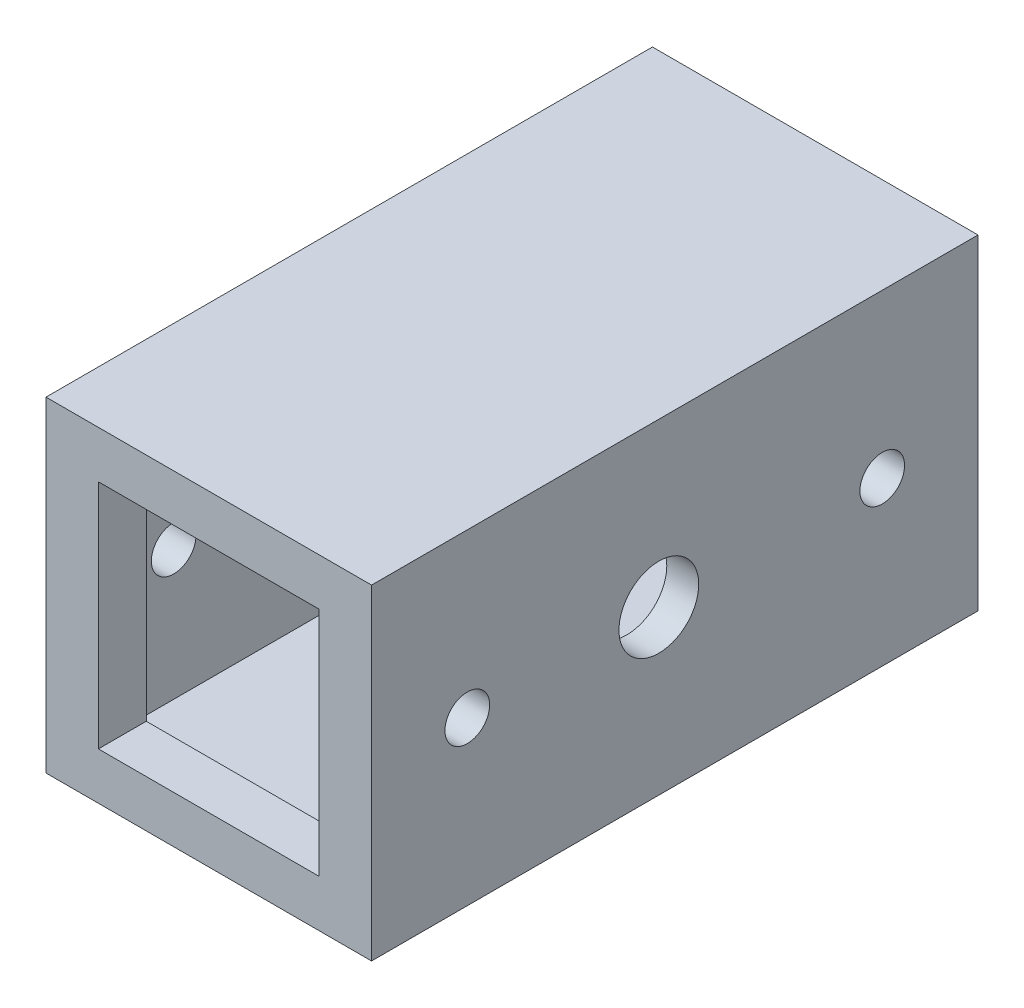
ISO-10303-21;
HEADER;
FILE_DESCRIPTION(('STEP AP214'),'2;1');
FILE_NAME('part.step','',(''),(''),'','','');
FILE_SCHEMA(('AUTOMOTIVE_DESIGN { 1 0 10303 214 1 1 1 1 }'));
ENDSEC;
DATA;
#1=APPLICATION_CONTEXT('core data for automotive mechanical design processes');
#2=APPLICATION_PROTOCOL_DEFINITION('international standard','automotive_design',2000,#1);
#3=PRODUCT_CONTEXT('',#1,'mechanical');
#4=PRODUCT('Part','Part','',(#3));
#5=PRODUCT_RELATED_PRODUCT_CATEGORY('part','',(#4));
#6=PRODUCT_DEFINITION_FORMATION('','',#4);
#7=PRODUCT_DEFINITION_CONTEXT('part definition',#1,'design');
#8=PRODUCT_DEFINITION('design','',#6,#7);
#9=PRODUCT_DEFINITION_SHAPE('','',#8);
#10=(LENGTH_UNIT() NAMED_UNIT(*) SI_UNIT(.MILLI.,.METRE.));
#11=(NAMED_UNIT(*) PLANE_ANGLE_UNIT() SI_UNIT($,.RADIAN.));
#12=(NAMED_UNIT(*) SI_UNIT($,.STERADIAN.) SOLID_ANGLE_UNIT());
#13=UNCERTAINTY_MEASURE_WITH_UNIT(LENGTH_MEASURE(1.E-05),#10,'distance_accuracy_value','');
#14=(GEOMETRIC_REPRESENTATION_CONTEXT(3) GLOBAL_UNCERTAINTY_ASSIGNED_CONTEXT((#13)) GLOBAL_UNIT_ASSIGNED_CONTEXT((#10,
#11,#12)) REPRESENTATION_CONTEXT('',''));
#15=CARTESIAN_POINT('',(0.,0.,0.));
#16=DIRECTION('',(0.,0.,1.));
#17=DIRECTION('',(1.,0.,0.));
#18=AXIS2_PLACEMENT_3D('',#15,#16,#17);
#19=CARTESIAN_POINT('',(10.2,-10.2,-35.));
#20=DIRECTION('',(1.,0.,0.));
#21=DIRECTION('',(0.,0.,-1.));
#22=AXIS2_PLACEMENT_3D('',#19,#20,#21);
#23=PLANE('',#22);
#24=CARTESIAN_POINT('',(10.2,0.,-2.99999999999998));
#25=DIRECTION('',(1.,0.,0.));
#26=DIRECTION('',(0.,0.,-1.));
#27=AXIS2_PLACEMENT_3D('',#24,#25,#26);
#28=CIRCLE('',#27,1.4);
#29=CARTESIAN_POINT('',(10.2,0.,-4.39999999999998));
#30=VERTEX_POINT('',#29);
#31=EDGE_CURVE('E686',#30,#30,#28,.T.);
#32=ORIENTED_EDGE('',*,*,#31,.F.);
#33=EDGE_LOOP('',(#32));
#34=FACE_BOUND('',#33,.T.);
#35=CARTESIAN_POINT('',(10.2,0.,-29.));
#36=DIRECTION('',(1.,0.,0.));
#37=DIRECTION('',(0.,0.,-1.));
#38=AXIS2_PLACEMENT_3D('',#35,#36,#37);
#39=CIRCLE('',#38,1.4);
#40=CARTESIAN_POINT('',(10.2,0.,-30.4));
#41=VERTEX_POINT('',#40);
#42=EDGE_CURVE('E684',#41,#41,#39,.T.);
#43=ORIENTED_EDGE('',*,*,#42,.F.);
#44=EDGE_LOOP('',(#43));
#45=FACE_BOUND('',#44,.T.);
#46=CARTESIAN_POINT('',(10.2,0.,-15.));
#47=DIRECTION('',(1.,0.,0.));
#48=DIRECTION('',(0.,0.,-1.));
#49=AXIS2_PLACEMENT_3D('',#46,#47,#48);
#50=CIRCLE('',#49,2.5);
#51=CARTESIAN_POINT('',(10.2,0.,-17.5));
#52=VERTEX_POINT('',#51);
#53=EDGE_CURVE('E336',#52,#52,#50,.T.);
#54=ORIENTED_EDGE('',*,*,#53,.F.);
#55=EDGE_LOOP('',(#54));
#56=FACE_BOUND('',#55,.T.);
#57=DIRECTION('',(0.,0.,1.));
#58=VECTOR('',#57,1.);
#59=CARTESIAN_POINT('',(10.2,10.2,-35.));
#60=LINE('',#59,#58);
#61=CARTESIAN_POINT('',(10.2,10.2,-35.));
#62=VERTEX_POINT('',#61);
#63=CARTESIAN_POINT('',(10.2,10.2,3.));
#64=VERTEX_POINT('',#63);
#65=EDGE_CURVE('E272',#62,#64,#60,.T.);
#66=ORIENTED_EDGE('',*,*,#65,.T.);
#67=DIRECTION('',(0.,1.,0.));
#68=VECTOR('',#67,1.);
#69=CARTESIAN_POINT('',(10.2,10.2,3.));
#70=LINE('',#69,#68);
#71=CARTESIAN_POINT('',(10.2,-10.2,3.));
#72=VERTEX_POINT('',#71);
#73=EDGE_CURVE('E181',#72,#64,#70,.T.);
#74=ORIENTED_EDGE('',*,*,#73,.F.);
#75=DIRECTION('',(0.,0.,1.));
#76=VECTOR('',#75,1.);
#77=CARTESIAN_POINT('',(10.2,-10.2,-35.));
#78=LINE('',#77,#76);
#79=CARTESIAN_POINT('',(10.2,-10.2,-35.));
#80=VERTEX_POINT('',#79);
#81=EDGE_CURVE('E273',#80,#72,#78,.T.);
#82=ORIENTED_EDGE('',*,*,#81,.F.);
#83=DIRECTION('',(0.,1.,0.));
#84=VECTOR('',#83,1.);
#85=CARTESIAN_POINT('',(10.2,-10.2,-35.));
#86=LINE('',#85,#84);
#87=EDGE_CURVE('E250',#80,#62,#86,.T.);
#88=ORIENTED_EDGE('',*,*,#87,.T.);
#89=EDGE_LOOP('',(#66,#74,#82,#88));
#90=FACE_BOUND('',#89,.T.);
#91=ADVANCED_FACE('F45',(#34,#45,#56,#90),#23,.T.);
#92=CARTESIAN_POINT('',(-10.2,-10.2,-35.));
#93=DIRECTION('',(0.,-1.,0.));
#94=DIRECTION('',(0.,0.,-1.));
#95=AXIS2_PLACEMENT_3D('',#92,#93,#94);
#96=PLANE('',#95);
#97=ORIENTED_EDGE('',*,*,#81,.T.);
#98=DIRECTION('',(1.,0.,0.));
#99=VECTOR('',#98,1.);
#100=CARTESIAN_POINT('',(10.2,-10.2,3.));
#101=LINE('',#100,#99);
#102=CARTESIAN_POINT('',(-10.2,-10.2,3.));
#103=VERTEX_POINT('',#102);
#104=EDGE_CURVE('E227',#103,#72,#101,.T.);
#105=ORIENTED_EDGE('',*,*,#104,.F.);
#106=DIRECTION('',(0.,0.,1.));
#107=VECTOR('',#106,1.);
#108=CARTESIAN_POINT('',(-10.2,-10.2,-35.));
#109=LINE('',#108,#107);
#110=CARTESIAN_POINT('',(-10.2,-10.2,-35.));
#111=VERTEX_POINT('',#110);
#112=EDGE_CURVE('E277',#111,#103,#109,.T.);
#113=ORIENTED_EDGE('',*,*,#112,.F.);
#114=DIRECTION('',(1.,0.,0.));
#115=VECTOR('',#114,1.);
#116=CARTESIAN_POINT('',(-10.2,-10.2,-35.));
#117=LINE('',#116,#115);
#118=EDGE_CURVE('E268',#111,#80,#117,.T.);
#119=ORIENTED_EDGE('',*,*,#118,.T.);
#120=EDGE_LOOP('',(#97,#105,#113,#119));
#121=FACE_BOUND('',#120,.T.);
#122=ADVANCED_FACE('F376',(#121),#96,.T.);
#123=CARTESIAN_POINT('',(-10.2,-10.2,-35.));
#124=DIRECTION('',(-1.,0.,0.));
#125=DIRECTION('',(0.,0.,1.));
#126=AXIS2_PLACEMENT_3D('',#123,#124,#125);
#127=PLANE('',#126);
#128=CARTESIAN_POINT('',(-10.2,0.,-2.99999999999998));
#129=DIRECTION('',(1.,0.,0.));
#130=DIRECTION('',(0.,0.,-1.));
#131=AXIS2_PLACEMENT_3D('',#128,#129,#130);
#132=CIRCLE('',#131,1.4);
#133=CARTESIAN_POINT('',(-10.2,0.,-4.39999999999998));
#134=VERTEX_POINT('',#133);
#135=EDGE_CURVE('E289',#134,#134,#132,.T.);
#136=ORIENTED_EDGE('',*,*,#135,.T.);
#137=EDGE_LOOP('',(#136));
#138=FACE_BOUND('',#137,.T.);
#139=CARTESIAN_POINT('',(-10.2,0.,-29.));
#140=DIRECTION('',(1.,0.,0.));
#141=DIRECTION('',(0.,0.,-1.));
#142=AXIS2_PLACEMENT_3D('',#139,#140,#141);
#143=CIRCLE('',#142,1.4);
#144=CARTESIAN_POINT('',(-10.2,0.,-30.4));
#145=VERTEX_POINT('',#144);
#146=EDGE_CURVE('E342',#145,#145,#143,.T.);
#147=ORIENTED_EDGE('',*,*,#146,.T.);
#148=EDGE_LOOP('',(#147));
#149=FACE_BOUND('',#148,.T.);
#150=CARTESIAN_POINT('',(-10.2,0.,-15.));
#151=DIRECTION('',(1.,0.,0.));
#152=DIRECTION('',(0.,0.,-1.));
#153=AXIS2_PLACEMENT_3D('',#150,#151,#152);
#154=CIRCLE('',#153,2.5);
#155=CARTESIAN_POINT('',(-10.2,0.,-17.5));
#156=VERTEX_POINT('',#155);
#157=EDGE_CURVE('E330',#156,#156,#154,.T.);
#158=ORIENTED_EDGE('',*,*,#157,.T.);
#159=EDGE_LOOP('',(#158));
#160=FACE_BOUND('',#159,.T.);
#161=ORIENTED_EDGE('',*,*,#112,.T.);
#162=DIRECTION('',(0.,-1.,0.));
#163=VECTOR('',#162,1.);
#164=CARTESIAN_POINT('',(-10.2,10.2,3.));
#165=LINE('',#164,#163);
#166=CARTESIAN_POINT('',(-10.2,10.2,3.));
#167=VERTEX_POINT('',#166);
#168=EDGE_CURVE('E224',#167,#103,#165,.T.);
#169=ORIENTED_EDGE('',*,*,#168,.F.);
#170=DIRECTION('',(0.,0.,1.));
#171=VECTOR('',#170,1.);
#172=CARTESIAN_POINT('',(-10.2,10.2,-35.));
#173=LINE('',#172,#171);
#174=CARTESIAN_POINT('',(-10.2,10.2,-35.));
#175=VERTEX_POINT('',#174);
#176=EDGE_CURVE('E280',#175,#167,#173,.T.);
#177=ORIENTED_EDGE('',*,*,#176,.F.);
#178=DIRECTION('',(0.,-1.,0.));
#179=VECTOR('',#178,1.);
#180=CARTESIAN_POINT('',(-10.2,-10.2,-35.));
#181=LINE('',#180,#179);
#182=EDGE_CURVE('E264',#175,#111,#181,.T.);
#183=ORIENTED_EDGE('',*,*,#182,.T.);
#184=EDGE_LOOP('',(#161,#169,#177,#183));
#185=FACE_BOUND('',#184,.T.);
#186=ADVANCED_FACE('F382',(#138,#149,#160,#185),#127,.T.);
#187=CARTESIAN_POINT('',(-10.2,10.2,-35.));
#188=DIRECTION('',(0.,1.,0.));
#189=DIRECTION('',(0.,0.,1.));
#190=AXIS2_PLACEMENT_3D('',#187,#188,#189);
#191=PLANE('',#190);
#192=ORIENTED_EDGE('',*,*,#176,.T.);
#193=DIRECTION('',(-1.,0.,0.));
#194=VECTOR('',#193,1.);
#195=CARTESIAN_POINT('',(10.2,10.2,3.));
#196=LINE('',#195,#194);
#197=EDGE_CURVE('E220',#64,#167,#196,.T.);
#198=ORIENTED_EDGE('',*,*,#197,.F.);
#199=ORIENTED_EDGE('',*,*,#65,.F.);
#200=DIRECTION('',(-1.,0.,0.));
#201=VECTOR('',#200,1.);
#202=CARTESIAN_POINT('',(-10.2,10.2,-35.));
#203=LINE('',#202,#201);
#204=EDGE_CURVE('E260',#62,#175,#203,.T.);
#205=ORIENTED_EDGE('',*,*,#204,.T.);
#206=EDGE_LOOP('',(#192,#198,#199,#205));
#207=FACE_BOUND('',#206,.T.);
#208=ADVANCED_FACE('F389',(#207),#191,.T.);
#209=CARTESIAN_POINT('',(0.,0.,-35.));
#210=DIRECTION('',(0.,0.,-1.));
#211=DIRECTION('',(-1.,0.,0.));
#212=AXIS2_PLACEMENT_3D('',#209,#210,#211);
#213=PLANE('',#212);
#214=DIRECTION('',(-1.,0.,0.));
#215=VECTOR('',#214,1.);
#216=CARTESIAN_POINT('',(-8.2,9.2,-35.));
#217=LINE('',#216,#215);
#218=CARTESIAN_POINT('',(9.2,9.2,-35.));
#219=VERTEX_POINT('',#218);
#220=CARTESIAN_POINT('',(-9.2,9.2,-35.));
#221=VERTEX_POINT('',#220);
#222=EDGE_CURVE('E276',#219,#221,#217,.T.);
#223=ORIENTED_EDGE('',*,*,#222,.T.);
#224=DIRECTION('',(0.,-1.,0.));
#225=VECTOR('',#224,1.);
#226=CARTESIAN_POINT('',(-9.2,-8.2,-35.));
#227=LINE('',#226,#225);
#228=CARTESIAN_POINT('',(-9.2,-9.2,-35.));
#229=VERTEX_POINT('',#228);
#230=EDGE_CURVE('E306',#221,#229,#227,.T.);
#231=ORIENTED_EDGE('',*,*,#230,.T.);
#232=DIRECTION('',(1.,0.,0.));
#233=VECTOR('',#232,1.);
#234=CARTESIAN_POINT('',(8.2,-9.2,-35.));
#235=LINE('',#234,#233);
#236=CARTESIAN_POINT('',(9.2,-9.2,-35.));
#237=VERTEX_POINT('',#236);
#238=EDGE_CURVE('E303',#229,#237,#235,.T.);
#239=ORIENTED_EDGE('',*,*,#238,.T.);
#240=DIRECTION('',(0.,1.,0.));
#241=VECTOR('',#240,1.);
#242=CARTESIAN_POINT('',(9.2,8.2,-35.));
#243=LINE('',#242,#241);
#244=EDGE_CURVE('E301',#237,#219,#243,.T.);
#245=ORIENTED_EDGE('',*,*,#244,.T.);
#246=EDGE_LOOP('',(#223,#231,#239,#245));
#247=FACE_BOUND('',#246,.T.);
#248=ORIENTED_EDGE('',*,*,#87,.F.);
#249=ORIENTED_EDGE('',*,*,#118,.F.);
#250=ORIENTED_EDGE('',*,*,#182,.F.);
#251=ORIENTED_EDGE('',*,*,#204,.F.);
#252=EDGE_LOOP('',(#248,#249,#250,#251));
#253=FACE_BOUND('',#252,.T.);
#254=ADVANCED_FACE('F415',(#247,#253),#213,.T.);
#255=CARTESIAN_POINT('',(8.2,-8.2,-35.));
#256=DIRECTION('',(1.,0.,0.));
#257=DIRECTION('',(0.,0.,-1.));
#258=AXIS2_PLACEMENT_3D('',#255,#256,#257);
#259=PLANE('',#258);
#260=CARTESIAN_POINT('',(8.19999999999999,0.,-2.99999999999998));
#261=DIRECTION('',(1.,0.,0.));
#262=DIRECTION('',(0.,0.,-1.));
#263=AXIS2_PLACEMENT_3D('',#260,#261,#262);
#264=CIRCLE('',#263,1.4);
#265=CARTESIAN_POINT('',(8.19999999999999,0.,-4.39999999999998));
#266=VERTEX_POINT('',#265);
#267=EDGE_CURVE('E202',#266,#266,#264,.T.);
#268=ORIENTED_EDGE('',*,*,#267,.T.);
#269=EDGE_LOOP('',(#268));
#270=FACE_BOUND('',#269,.T.);
#271=CARTESIAN_POINT('',(8.19999999999999,0.,-29.));
#272=DIRECTION('',(1.,0.,0.));
#273=DIRECTION('',(0.,0.,-1.));
#274=AXIS2_PLACEMENT_3D('',#271,#272,#273);
#275=CIRCLE('',#274,1.4);
#276=CARTESIAN_POINT('',(8.19999999999999,0.,-30.4));
#277=VERTEX_POINT('',#276);
#278=EDGE_CURVE('E294',#277,#277,#275,.T.);
#279=ORIENTED_EDGE('',*,*,#278,.T.);
#280=EDGE_LOOP('',(#279));
#281=FACE_BOUND('',#280,.T.);
#282=CARTESIAN_POINT('',(8.19999999999999,0.,-15.));
#283=DIRECTION('',(1.,0.,0.));
#284=DIRECTION('',(0.,0.,-1.));
#285=AXIS2_PLACEMENT_3D('',#282,#283,#284);
#286=CIRCLE('',#285,2.5);
#287=CARTESIAN_POINT('',(8.19999999999999,0.,-17.5));
#288=VERTEX_POINT('',#287);
#289=EDGE_CURVE('E288',#288,#288,#286,.T.);
#290=ORIENTED_EDGE('',*,*,#289,.T.);
#291=EDGE_LOOP('',(#290));
#292=FACE_BOUND('',#291,.T.);
#293=DIRECTION('',(0.,0.,1.));
#294=VECTOR('',#293,1.);
#295=CARTESIAN_POINT('',(8.2,8.2,-35.));
#296=LINE('',#295,#294);
#297=CARTESIAN_POINT('',(8.2,8.2,-34.));
#298=VERTEX_POINT('',#297);
#299=CARTESIAN_POINT('',(8.2,8.2,0.));
#300=VERTEX_POINT('',#299);
#301=EDGE_CURVE('E246',#298,#300,#296,.T.);
#302=ORIENTED_EDGE('',*,*,#301,.F.);
#303=DIRECTION('',(0.,1.,0.));
#304=VECTOR('',#303,1.);
#305=CARTESIAN_POINT('',(8.2,-8.2,-34.));
#306=LINE('',#305,#304);
#307=CARTESIAN_POINT('',(8.2,-8.2,-34.));
#308=VERTEX_POINT('',#307);
#309=EDGE_CURVE('E55',#298,#308,#306,.F.);
#310=ORIENTED_EDGE('',*,*,#309,.T.);
#311=DIRECTION('',(0.,0.,1.));
#312=VECTOR('',#311,1.);
#313=CARTESIAN_POINT('',(8.2,-8.2,-35.));
#314=LINE('',#313,#312);
#315=CARTESIAN_POINT('',(8.2,-8.2,0.));
#316=VERTEX_POINT('',#315);
#317=EDGE_CURVE('E247',#308,#316,#314,.T.);
#318=ORIENTED_EDGE('',*,*,#317,.T.);
#319=DIRECTION('',(0.,1.,0.));
#320=VECTOR('',#319,1.);
#321=CARTESIAN_POINT('',(8.2,-8.2,0.));
#322=LINE('',#321,#320);
#323=EDGE_CURVE('E231',#316,#300,#322,.T.);
#324=ORIENTED_EDGE('',*,*,#323,.T.);
#325=EDGE_LOOP('',(#302,#310,#318,#324));
#326=FACE_BOUND('',#325,.T.);
#327=ADVANCED_FACE('F353',(#270,#281,#292,#326),#259,.F.);
#328=CARTESIAN_POINT('',(-8.2,-8.2,-35.));
#329=DIRECTION('',(0.,-1.,0.));
#330=DIRECTION('',(0.,0.,-1.));
#331=AXIS2_PLACEMENT_3D('',#328,#329,#330);
#332=PLANE('',#331);
#333=ORIENTED_EDGE('',*,*,#317,.F.);
#334=DIRECTION('',(1.,0.,0.));
#335=VECTOR('',#334,1.);
#336=CARTESIAN_POINT('',(-8.2,-8.2,-34.));
#337=LINE('',#336,#335);
#338=CARTESIAN_POINT('',(-8.2,-8.2,-34.));
#339=VERTEX_POINT('',#338);
#340=EDGE_CURVE('E314',#308,#339,#337,.F.);
#341=ORIENTED_EDGE('',*,*,#340,.T.);
#342=DIRECTION('',(0.,0.,1.));
#343=VECTOR('',#342,1.);
#344=CARTESIAN_POINT('',(-8.2,-8.2,-35.));
#345=LINE('',#344,#343);
#346=CARTESIAN_POINT('',(-8.2,-8.2,0.));
#347=VERTEX_POINT('',#346);
#348=EDGE_CURVE('E251',#339,#347,#345,.T.);
#349=ORIENTED_EDGE('',*,*,#348,.T.);
#350=DIRECTION('',(1.,0.,0.));
#351=VECTOR('',#350,1.);
#352=CARTESIAN_POINT('',(-8.2,-8.2,0.));
#353=LINE('',#352,#351);
#354=EDGE_CURVE('E242',#347,#316,#353,.T.);
#355=ORIENTED_EDGE('',*,*,#354,.T.);
#356=EDGE_LOOP('',(#333,#341,#349,#355));
#357=FACE_BOUND('',#356,.T.);
#358=ADVANCED_FACE('F468',(#357),#332,.F.);
#359=CARTESIAN_POINT('',(-8.2,-8.2,-35.));
#360=DIRECTION('',(-1.,0.,0.));
#361=DIRECTION('',(0.,0.,1.));
#362=AXIS2_PLACEMENT_3D('',#359,#360,#361);
#363=PLANE('',#362);
#364=CARTESIAN_POINT('',(-8.2,0.,-2.99999999999998));
#365=DIRECTION('',(-1.,0.,0.));
#366=DIRECTION('',(0.,0.,1.));
#367=AXIS2_PLACEMENT_3D('',#364,#365,#366);
#368=CIRCLE('',#367,1.4);
#369=CARTESIAN_POINT('',(-8.2,0.,-1.59999999999998));
#370=VERTEX_POINT('',#369);
#371=EDGE_CURVE('E295',#370,#370,#368,.T.);
#372=ORIENTED_EDGE('',*,*,#371,.T.);
#373=EDGE_LOOP('',(#372));
#374=FACE_BOUND('',#373,.T.);
#375=CARTESIAN_POINT('',(-8.2,0.,-29.));
#376=DIRECTION('',(-1.,0.,0.));
#377=DIRECTION('',(0.,0.,1.));
#378=AXIS2_PLACEMENT_3D('',#375,#376,#377);
#379=CIRCLE('',#378,1.4);
#380=CARTESIAN_POINT('',(-8.2,0.,-27.6));
#381=VERTEX_POINT('',#380);
#382=EDGE_CURVE('E290',#381,#381,#379,.T.);
#383=ORIENTED_EDGE('',*,*,#382,.T.);
#384=EDGE_LOOP('',(#383));
#385=FACE_BOUND('',#384,.T.);
#386=CARTESIAN_POINT('',(-8.2,0.,-15.));
#387=DIRECTION('',(-1.,0.,0.));
#388=DIRECTION('',(0.,0.,1.));
#389=AXIS2_PLACEMENT_3D('',#386,#387,#388);
#390=CIRCLE('',#389,2.5);
#391=CARTESIAN_POINT('',(-8.2,0.,-12.5));
#392=VERTEX_POINT('',#391);
#393=EDGE_CURVE('E284',#392,#392,#390,.T.);
#394=ORIENTED_EDGE('',*,*,#393,.T.);
#395=EDGE_LOOP('',(#394));
#396=FACE_BOUND('',#395,.T.);
#397=ORIENTED_EDGE('',*,*,#348,.F.);
#398=DIRECTION('',(0.,-1.,0.));
#399=VECTOR('',#398,1.);
#400=CARTESIAN_POINT('',(-8.2,8.2,-34.));
#401=LINE('',#400,#399);
#402=CARTESIAN_POINT('',(-8.2,8.2,-34.));
#403=VERTEX_POINT('',#402);
#404=EDGE_CURVE('E310',#339,#403,#401,.F.);
#405=ORIENTED_EDGE('',*,*,#404,.T.);
#406=DIRECTION('',(0.,0.,1.));
#407=VECTOR('',#406,1.);
#408=CARTESIAN_POINT('',(-8.2,8.2,-35.));
#409=LINE('',#408,#407);
#410=CARTESIAN_POINT('',(-8.2,8.2,0.));
#411=VERTEX_POINT('',#410);
#412=EDGE_CURVE('E254',#403,#411,#409,.T.);
#413=ORIENTED_EDGE('',*,*,#412,.T.);
#414=DIRECTION('',(0.,-1.,0.));
#415=VECTOR('',#414,1.);
#416=CARTESIAN_POINT('',(-8.2,-8.2,0.));
#417=LINE('',#416,#415);
#418=EDGE_CURVE('E238',#411,#347,#417,.T.);
#419=ORIENTED_EDGE('',*,*,#418,.T.);
#420=EDGE_LOOP('',(#397,#405,#413,#419));
#421=FACE_BOUND('',#420,.T.);
#422=ADVANCED_FACE('F479',(#374,#385,#396,#421),#363,.F.);
#423=CARTESIAN_POINT('',(-8.2,8.2,-35.));
#424=DIRECTION('',(0.,1.,0.));
#425=DIRECTION('',(0.,0.,1.));
#426=AXIS2_PLACEMENT_3D('',#423,#424,#425);
#427=PLANE('',#426);
#428=ORIENTED_EDGE('',*,*,#412,.F.);
#429=DIRECTION('',(-1.,0.,0.));
#430=VECTOR('',#429,1.);
#431=CARTESIAN_POINT('',(8.2,8.2,-34.));
#432=LINE('',#431,#430);
#433=EDGE_CURVE('E11',#403,#298,#432,.F.);
#434=ORIENTED_EDGE('',*,*,#433,.T.);
#435=ORIENTED_EDGE('',*,*,#301,.T.);
#436=DIRECTION('',(-1.,0.,0.));
#437=VECTOR('',#436,1.);
#438=CARTESIAN_POINT('',(-8.2,8.2,0.));
#439=LINE('',#438,#437);
#440=EDGE_CURVE('E234',#300,#411,#439,.T.);
#441=ORIENTED_EDGE('',*,*,#440,.T.);
#442=EDGE_LOOP('',(#428,#434,#435,#441));
#443=FACE_BOUND('',#442,.T.);
#444=ADVANCED_FACE('F491',(#443),#427,.F.);
#445=CARTESIAN_POINT('',(0.,0.,0.));
#446=DIRECTION('',(0.,0.,-1.));
#447=DIRECTION('',(-1.,0.,0.));
#448=AXIS2_PLACEMENT_3D('',#445,#446,#447);
#449=PLANE('',#448);
#450=DIRECTION('',(-1.,0.,0.));
#451=VECTOR('',#450,1.);
#452=CARTESIAN_POINT('',(6.9173511930245,7.24862700945783,0.));
#453=LINE('',#452,#451);
#454=CARTESIAN_POINT('',(6.9173511930245,7.24862700945783,0.));
#455=VERTEX_POINT('',#454);
#456=CARTESIAN_POINT('',(-6.9173511930245,7.24862700945783,0.));
#457=VERTEX_POINT('',#456);
#458=EDGE_CURVE('E173',#455,#457,#453,.T.);
#459=ORIENTED_EDGE('',*,*,#458,.T.);
#460=DIRECTION('',(0.,-1.,0.));
#461=VECTOR('',#460,1.);
#462=CARTESIAN_POINT('',(-6.9173511930245,-7.24862700945783,0.));
#463=LINE('',#462,#461);
#464=CARTESIAN_POINT('',(-6.9173511930245,-7.24862700945783,0.));
#465=VERTEX_POINT('',#464);
#466=EDGE_CURVE('E199',#457,#465,#463,.T.);
#467=ORIENTED_EDGE('',*,*,#466,.T.);
#468=DIRECTION('',(1.,0.,0.));
#469=VECTOR('',#468,1.);
#470=CARTESIAN_POINT('',(6.9173511930245,-7.24862700945783,0.));
#471=LINE('',#470,#469);
#472=CARTESIAN_POINT('',(6.9173511930245,-7.24862700945783,0.));
#473=VERTEX_POINT('',#472);
#474=EDGE_CURVE('E179',#465,#473,#471,.T.);
#475=ORIENTED_EDGE('',*,*,#474,.T.);
#476=DIRECTION('',(0.,1.,0.));
#477=VECTOR('',#476,1.);
#478=CARTESIAN_POINT('',(6.9173511930245,-7.24862700945783,0.));
#479=LINE('',#478,#477);
#480=EDGE_CURVE('E205',#473,#455,#479,.T.);
#481=ORIENTED_EDGE('',*,*,#480,.T.);
#482=EDGE_LOOP('',(#459,#467,#475,#481));
#483=FACE_BOUND('',#482,.T.);
#484=ORIENTED_EDGE('',*,*,#440,.F.);
#485=ORIENTED_EDGE('',*,*,#323,.F.);
#486=ORIENTED_EDGE('',*,*,#354,.F.);
#487=ORIENTED_EDGE('',*,*,#418,.F.);
#488=EDGE_LOOP('',(#484,#485,#486,#487));
#489=FACE_BOUND('',#488,.T.);
#490=ADVANCED_FACE('F501',(#483,#489),#449,.T.);
#491=CARTESIAN_POINT('',(0.,0.,3.));
#492=DIRECTION('',(0.,0.,-1.));
#493=DIRECTION('',(-1.,0.,0.));
#494=AXIS2_PLACEMENT_3D('',#491,#492,#493);
#495=PLANE('',#494);
#496=ORIENTED_EDGE('',*,*,#73,.T.);
#497=ORIENTED_EDGE('',*,*,#197,.T.);
#498=ORIENTED_EDGE('',*,*,#168,.T.);
#499=ORIENTED_EDGE('',*,*,#104,.T.);
#500=EDGE_LOOP('',(#496,#497,#498,#499));
#501=FACE_BOUND('',#500,.T.);
#502=DIRECTION('',(0.,-1.,0.));
#503=VECTOR('',#502,1.);
#504=CARTESIAN_POINT('',(-6.9173511930245,-7.24862700945783,3.));
#505=LINE('',#504,#503);
#506=CARTESIAN_POINT('',(-6.9173511930245,7.24862700945783,3.));
#507=VERTEX_POINT('',#506);
#508=CARTESIAN_POINT('',(-6.9173511930245,-7.24862700945783,3.));
#509=VERTEX_POINT('',#508);
#510=EDGE_CURVE('E161',#507,#509,#505,.T.);
#511=ORIENTED_EDGE('',*,*,#510,.F.);
#512=DIRECTION('',(-1.,0.,0.));
#513=VECTOR('',#512,1.);
#514=CARTESIAN_POINT('',(6.9173511930245,7.24862700945783,3.));
#515=LINE('',#514,#513);
#516=CARTESIAN_POINT('',(6.9173511930245,7.24862700945783,3.));
#517=VERTEX_POINT('',#516);
#518=EDGE_CURVE('E193',#517,#507,#515,.T.);
#519=ORIENTED_EDGE('',*,*,#518,.F.);
#520=DIRECTION('',(0.,1.,0.));
#521=VECTOR('',#520,1.);
#522=CARTESIAN_POINT('',(6.9173511930245,-7.24862700945783,3.));
#523=LINE('',#522,#521);
#524=CARTESIAN_POINT('',(6.9173511930245,-7.24862700945783,3.));
#525=VERTEX_POINT('',#524);
#526=EDGE_CURVE('E187',#525,#517,#523,.T.);
#527=ORIENTED_EDGE('',*,*,#526,.F.);
#528=DIRECTION('',(1.,0.,0.));
#529=VECTOR('',#528,1.);
#530=CARTESIAN_POINT('',(6.9173511930245,-7.24862700945783,3.));
#531=LINE('',#530,#529);
#532=EDGE_CURVE('E172',#509,#525,#531,.T.);
#533=ORIENTED_EDGE('',*,*,#532,.F.);
#534=EDGE_LOOP('',(#511,#519,#527,#533));
#535=FACE_BOUND('',#534,.T.);
#536=ADVANCED_FACE('F185',(#501,#535),#495,.F.);
#537=CARTESIAN_POINT('',(-6.9173511930245,-7.24862700945783,3.));
#538=DIRECTION('',(1.,0.,0.));
#539=DIRECTION('',(0.,0.,-1.));
#540=AXIS2_PLACEMENT_3D('',#537,#538,#539);
#541=PLANE('',#540);
#542=ORIENTED_EDGE('',*,*,#466,.F.);
#543=DIRECTION('',(0.,0.,-1.));
#544=VECTOR('',#543,1.);
#545=CARTESIAN_POINT('',(-6.9173511930245,7.24862700945783,3.));
#546=LINE('',#545,#544);
#547=EDGE_CURVE('E167',#507,#457,#546,.T.);
#548=ORIENTED_EDGE('',*,*,#547,.F.);
#549=ORIENTED_EDGE('',*,*,#510,.T.);
#550=DIRECTION('',(0.,0.,-1.));
#551=VECTOR('',#550,1.);
#552=CARTESIAN_POINT('',(-6.9173511930245,-7.24862700945783,3.));
#553=LINE('',#552,#551);
#554=EDGE_CURVE('E164',#509,#465,#553,.T.);
#555=ORIENTED_EDGE('',*,*,#554,.T.);
#556=EDGE_LOOP('',(#542,#548,#549,#555));
#557=FACE_BOUND('',#556,.T.);
#558=ADVANCED_FACE('F163',(#557),#541,.T.);
#559=CARTESIAN_POINT('',(6.9173511930245,-7.24862700945783,3.));
#560=DIRECTION('',(0.,1.,0.));
#561=DIRECTION('',(0.,0.,1.));
#562=AXIS2_PLACEMENT_3D('',#559,#560,#561);
#563=PLANE('',#562);
#564=ORIENTED_EDGE('',*,*,#474,.F.);
#565=ORIENTED_EDGE('',*,*,#554,.F.);
#566=ORIENTED_EDGE('',*,*,#532,.T.);
#567=DIRECTION('',(0.,0.,-1.));
#568=VECTOR('',#567,1.);
#569=CARTESIAN_POINT('',(6.9173511930245,-7.24862700945783,3.));
#570=LINE('',#569,#568);
#571=EDGE_CURVE('E182',#525,#473,#570,.T.);
#572=ORIENTED_EDGE('',*,*,#571,.T.);
#573=EDGE_LOOP('',(#564,#565,#566,#572));
#574=FACE_BOUND('',#573,.T.);
#575=ADVANCED_FACE('F176',(#574),#563,.T.);
#576=CARTESIAN_POINT('',(6.9173511930245,-7.24862700945783,3.));
#577=DIRECTION('',(-1.,0.,0.));
#578=DIRECTION('',(0.,0.,1.));
#579=AXIS2_PLACEMENT_3D('',#576,#577,#578);
#580=PLANE('',#579);
#581=ORIENTED_EDGE('',*,*,#480,.F.);
#582=ORIENTED_EDGE('',*,*,#571,.F.);
#583=ORIENTED_EDGE('',*,*,#526,.T.);
#584=DIRECTION('',(0.,0.,-1.));
#585=VECTOR('',#584,1.);
#586=CARTESIAN_POINT('',(6.9173511930245,7.24862700945783,3.));
#587=LINE('',#586,#585);
#588=EDGE_CURVE('E213',#517,#455,#587,.T.);
#589=ORIENTED_EDGE('',*,*,#588,.T.);
#590=EDGE_LOOP('',(#581,#582,#583,#589));
#591=FACE_BOUND('',#590,.T.);
#592=ADVANCED_FACE('F550',(#591),#580,.T.);
#593=CARTESIAN_POINT('',(6.9173511930245,7.24862700945783,3.));
#594=DIRECTION('',(0.,-1.,0.));
#595=DIRECTION('',(0.,0.,-1.));
#596=AXIS2_PLACEMENT_3D('',#593,#594,#595);
#597=PLANE('',#596);
#598=ORIENTED_EDGE('',*,*,#458,.F.);
#599=ORIENTED_EDGE('',*,*,#588,.F.);
#600=ORIENTED_EDGE('',*,*,#518,.T.);
#601=ORIENTED_EDGE('',*,*,#547,.T.);
#602=EDGE_LOOP('',(#598,#599,#600,#601));
#603=FACE_BOUND('',#602,.T.);
#604=ADVANCED_FACE('F543',(#603),#597,.T.);
#605=CARTESIAN_POINT('',(-10.2,0.,-15.));
#606=DIRECTION('',(1.,0.,0.));
#607=DIRECTION('',(0.,0.,-1.));
#608=AXIS2_PLACEMENT_3D('',#605,#606,#607);
#609=CYLINDRICAL_SURFACE('',#608,2.5);
#610=ORIENTED_EDGE('',*,*,#157,.F.);
#611=EDGE_LOOP('',(#610));
#612=FACE_BOUND('',#611,.T.);
#613=ORIENTED_EDGE('',*,*,#393,.F.);
#614=EDGE_LOOP('',(#613));
#615=FACE_BOUND('',#614,.T.);
#616=ADVANCED_FACE('F421',(#612,#615),#609,.F.);
#617=CARTESIAN_POINT('',(-10.2,0.,-29.));
#618=DIRECTION('',(1.,0.,0.));
#619=DIRECTION('',(0.,0.,-1.));
#620=AXIS2_PLACEMENT_3D('',#617,#618,#619);
#621=CYLINDRICAL_SURFACE('',#620,1.4);
#622=ORIENTED_EDGE('',*,*,#146,.F.);
#623=EDGE_LOOP('',(#622));
#624=FACE_BOUND('',#623,.T.);
#625=ORIENTED_EDGE('',*,*,#382,.F.);
#626=EDGE_LOOP('',(#625));
#627=FACE_BOUND('',#626,.T.);
#628=ADVANCED_FACE('F371',(#624,#627),#621,.F.);
#629=CARTESIAN_POINT('',(-10.2,0.,-2.99999999999998));
#630=DIRECTION('',(1.,0.,0.));
#631=DIRECTION('',(0.,0.,-1.));
#632=AXIS2_PLACEMENT_3D('',#629,#630,#631);
#633=CYLINDRICAL_SURFACE('',#632,1.4);
#634=ORIENTED_EDGE('',*,*,#135,.F.);
#635=EDGE_LOOP('',(#634));
#636=FACE_BOUND('',#635,.T.);
#637=ORIENTED_EDGE('',*,*,#371,.F.);
#638=EDGE_LOOP('',(#637));
#639=FACE_BOUND('',#638,.T.);
#640=ADVANCED_FACE('F361',(#636,#639),#633,.F.);
#641=ORIENTED_EDGE('',*,*,#53,.T.);
#642=EDGE_LOOP('',(#641));
#643=FACE_BOUND('',#642,.T.);
#644=ORIENTED_EDGE('',*,*,#289,.F.);
#645=EDGE_LOOP('',(#644));
#646=FACE_BOUND('',#645,.T.);
#647=ADVANCED_FACE('F368',(#643,#646),#609,.F.);
#648=ORIENTED_EDGE('',*,*,#42,.T.);
#649=EDGE_LOOP('',(#648));
#650=FACE_BOUND('',#649,.T.);
#651=ORIENTED_EDGE('',*,*,#278,.F.);
#652=EDGE_LOOP('',(#651));
#653=FACE_BOUND('',#652,.T.);
#654=ADVANCED_FACE('F358',(#650,#653),#621,.F.);
#655=ORIENTED_EDGE('',*,*,#31,.T.);
#656=EDGE_LOOP('',(#655));
#657=FACE_BOUND('',#656,.T.);
#658=ORIENTED_EDGE('',*,*,#267,.F.);
#659=EDGE_LOOP('',(#658));
#660=FACE_BOUND('',#659,.T.);
#661=ADVANCED_FACE('F356',(#657,#660),#633,.F.);
#662=CARTESIAN_POINT('',(9.2,0.,-34.));
#663=DIRECTION('',(0.,-1.,0.));
#664=DIRECTION('',(0.,0.,-1.));
#665=AXIS2_PLACEMENT_3D('',#662,#663,#664);
#666=CYLINDRICAL_SURFACE('',#665,1.);
#667=CARTESIAN_POINT('',(9.2,-9.2,-34.));
#668=DIRECTION('',(-0.707106781186547,-0.707106781186547,0.));
#669=DIRECTION('',(-0.707106781186547,0.707106781186547,0.));
#670=AXIS2_PLACEMENT_3D('',#667,#668,#669);
#671=ELLIPSE('',#670,1.41421356237309,1.);
#672=EDGE_CURVE('E323',#308,#237,#671,.T.);
#673=ORIENTED_EDGE('',*,*,#672,.F.);
#674=ORIENTED_EDGE('',*,*,#309,.F.);
#675=CARTESIAN_POINT('',(9.2,9.2,-34.));
#676=DIRECTION('',(0.707106781186547,-0.707106781186547,0.));
#677=DIRECTION('',(-0.707106781186547,-0.707106781186547,0.));
#678=AXIS2_PLACEMENT_3D('',#675,#676,#677);
#679=ELLIPSE('',#678,1.41421356237309,1.);
#680=EDGE_CURVE('E49',#219,#298,#679,.F.);
#681=ORIENTED_EDGE('',*,*,#680,.F.);
#682=ORIENTED_EDGE('',*,*,#244,.F.);
#683=EDGE_LOOP('',(#673,#674,#681,#682));
#684=FACE_BOUND('',#683,.T.);
#685=ADVANCED_FACE('F47',(#684),#666,.T.);
#686=CARTESIAN_POINT('',(0.,9.2,-34.));
#687=DIRECTION('',(1.,0.,0.));
#688=DIRECTION('',(0.,0.,-1.));
#689=AXIS2_PLACEMENT_3D('',#686,#687,#688);
#690=CYLINDRICAL_SURFACE('',#689,1.);
#691=ORIENTED_EDGE('',*,*,#680,.T.);
#692=ORIENTED_EDGE('',*,*,#433,.F.);
#693=CARTESIAN_POINT('',(-9.2,9.2,-34.));
#694=DIRECTION('',(0.707106781186547,0.707106781186547,0.));
#695=DIRECTION('',(-0.707106781186547,0.707106781186547,0.));
#696=AXIS2_PLACEMENT_3D('',#693,#694,#695);
#697=ELLIPSE('',#696,1.41421356237309,1.);
#698=EDGE_CURVE('E321',#221,#403,#697,.F.);
#699=ORIENTED_EDGE('',*,*,#698,.F.);
#700=ORIENTED_EDGE('',*,*,#222,.F.);
#701=EDGE_LOOP('',(#691,#692,#699,#700));
#702=FACE_BOUND('',#701,.T.);
#703=ADVANCED_FACE('F366',(#702),#690,.T.);
#704=CARTESIAN_POINT('',(0.,-9.2,-34.));
#705=DIRECTION('',(-1.,0.,0.));
#706=DIRECTION('',(0.,0.,1.));
#707=AXIS2_PLACEMENT_3D('',#704,#705,#706);
#708=CYLINDRICAL_SURFACE('',#707,1.);
#709=ORIENTED_EDGE('',*,*,#672,.T.);
#710=ORIENTED_EDGE('',*,*,#238,.F.);
#711=CARTESIAN_POINT('',(-9.2,-9.2,-34.));
#712=DIRECTION('',(-0.707106781186547,0.707106781186547,0.));
#713=DIRECTION('',(0.707106781186547,0.707106781186547,0.));
#714=AXIS2_PLACEMENT_3D('',#711,#712,#713);
#715=ELLIPSE('',#714,1.41421356237309,1.);
#716=EDGE_CURVE('E318',#339,#229,#715,.T.);
#717=ORIENTED_EDGE('',*,*,#716,.F.);
#718=ORIENTED_EDGE('',*,*,#340,.F.);
#719=EDGE_LOOP('',(#709,#710,#717,#718));
#720=FACE_BOUND('',#719,.T.);
#721=ADVANCED_FACE('F394',(#720),#708,.T.);
#722=CARTESIAN_POINT('',(-9.2,0.,-34.));
#723=DIRECTION('',(0.,1.,0.));
#724=DIRECTION('',(0.,0.,1.));
#725=AXIS2_PLACEMENT_3D('',#722,#723,#724);
#726=CYLINDRICAL_SURFACE('',#725,1.);
#727=ORIENTED_EDGE('',*,*,#698,.T.);
#728=ORIENTED_EDGE('',*,*,#404,.F.);
#729=ORIENTED_EDGE('',*,*,#716,.T.);
#730=ORIENTED_EDGE('',*,*,#230,.F.);
#731=EDGE_LOOP('',(#727,#728,#729,#730));
#732=FACE_BOUND('',#731,.T.);
#733=ADVANCED_FACE('F391',(#732),#726,.T.);
#734=CLOSED_SHELL('',(#91,#122,#186,#208,#254,#327,#358,#422,#444,#490,#536,#558,#575,#592,#604,
#616,#628,#640,#647,#654,#661,#685,#703,#721,#733));
#735=MANIFOLD_SOLID_BREP('B2',#734);
#736=ADVANCED_BREP_SHAPE_REPRESENTATION('',(#18,#735),#14);
#737=SHAPE_DEFINITION_REPRESENTATION(#9,#736);
ENDSEC;
END-ISO-10303-21;
